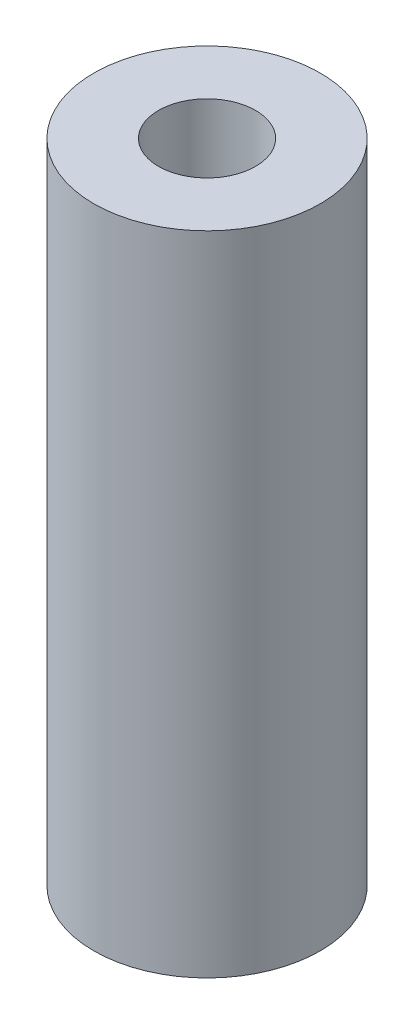
ISO-10303-21;
HEADER;
FILE_DESCRIPTION(('STEP AP214'),'2;1');
FILE_NAME('part.step','',(''),(''),'','','');
FILE_SCHEMA(('AUTOMOTIVE_DESIGN { 1 0 10303 214 1 1 1 1 }'));
ENDSEC;
DATA;
#1=APPLICATION_CONTEXT('core data for automotive mechanical design processes');
#2=APPLICATION_PROTOCOL_DEFINITION('international standard','automotive_design',2000,#1);
#3=PRODUCT_CONTEXT('',#1,'mechanical');
#4=PRODUCT('Part','Part','',(#3));
#5=PRODUCT_RELATED_PRODUCT_CATEGORY('part','',(#4));
#6=PRODUCT_DEFINITION_FORMATION('','',#4);
#7=PRODUCT_DEFINITION_CONTEXT('part definition',#1,'design');
#8=PRODUCT_DEFINITION('design','',#6,#7);
#9=PRODUCT_DEFINITION_SHAPE('','',#8);
#10=(LENGTH_UNIT() NAMED_UNIT(*) SI_UNIT(.MILLI.,.METRE.));
#11=(NAMED_UNIT(*) PLANE_ANGLE_UNIT() SI_UNIT($,.RADIAN.));
#12=(NAMED_UNIT(*) SI_UNIT($,.STERADIAN.) SOLID_ANGLE_UNIT());
#13=UNCERTAINTY_MEASURE_WITH_UNIT(LENGTH_MEASURE(1.E-05),#10,'distance_accuracy_value','');
#14=(GEOMETRIC_REPRESENTATION_CONTEXT(3) GLOBAL_UNCERTAINTY_ASSIGNED_CONTEXT((#13)) GLOBAL_UNIT_ASSIGNED_CONTEXT((#10,
#11,#12)) REPRESENTATION_CONTEXT('',''));
#15=CARTESIAN_POINT('',(0.,0.,0.));
#16=DIRECTION('',(0.,0.,1.));
#17=DIRECTION('',(1.,0.,0.));
#18=AXIS2_PLACEMENT_3D('',#15,#16,#17);
#19=CARTESIAN_POINT('',(0.,20.,0.));
#20=DIRECTION('',(0.,1.,0.));
#21=DIRECTION('',(0.,0.,1.));
#22=AXIS2_PLACEMENT_3D('',#19,#20,#21);
#23=PLANE('',#22);
#24=CARTESIAN_POINT('',(0.,20.,0.));
#25=DIRECTION('',(0.,1.,0.));
#26=DIRECTION('',(0.,0.,1.));
#27=AXIS2_PLACEMENT_3D('',#24,#25,#26);
#28=CIRCLE('',#27,3.5);
#29=CARTESIAN_POINT('',(0.,20.,3.5));
#30=VERTEX_POINT('',#29);
#31=EDGE_CURVE('E10',#30,#30,#28,.T.);
#32=ORIENTED_EDGE('',*,*,#31,.T.);
#33=EDGE_LOOP('',(#32));
#34=FACE_BOUND('',#33,.T.);
#35=CARTESIAN_POINT('',(0.,20.,0.));
#36=DIRECTION('',(0.,1.,0.));
#37=DIRECTION('',(0.,0.,1.));
#38=AXIS2_PLACEMENT_3D('',#35,#36,#37);
#39=CIRCLE('',#38,1.5);
#40=CARTESIAN_POINT('',(0.,20.,1.5));
#41=VERTEX_POINT('',#40);
#42=EDGE_CURVE('E48',#41,#41,#39,.T.);
#43=ORIENTED_EDGE('',*,*,#42,.F.);
#44=EDGE_LOOP('',(#43));
#45=FACE_BOUND('',#44,.T.);
#46=ADVANCED_FACE('F37',(#34,#45),#23,.T.);
#47=CARTESIAN_POINT('',(0.,0.,0.));
#48=DIRECTION('',(0.,1.,0.));
#49=DIRECTION('',(0.,0.,1.));
#50=AXIS2_PLACEMENT_3D('',#47,#48,#49);
#51=PLANE('',#50);
#52=CARTESIAN_POINT('',(0.,0.,0.));
#53=DIRECTION('',(0.,1.,0.));
#54=DIRECTION('',(0.,0.,1.));
#55=AXIS2_PLACEMENT_3D('',#52,#53,#54);
#56=CIRCLE('',#55,3.5);
#57=CARTESIAN_POINT('',(0.,0.,3.5));
#58=VERTEX_POINT('',#57);
#59=EDGE_CURVE('E41',#58,#58,#56,.T.);
#60=ORIENTED_EDGE('',*,*,#59,.F.);
#61=EDGE_LOOP('',(#60));
#62=FACE_BOUND('',#61,.T.);
#63=CARTESIAN_POINT('',(0.,0.,0.));
#64=DIRECTION('',(0.,1.,0.));
#65=DIRECTION('',(0.,0.,1.));
#66=AXIS2_PLACEMENT_3D('',#63,#64,#65);
#67=CIRCLE('',#66,1.5);
#68=CARTESIAN_POINT('',(0.,0.,1.5));
#69=VERTEX_POINT('',#68);
#70=EDGE_CURVE('E50',#69,#69,#67,.T.);
#71=ORIENTED_EDGE('',*,*,#70,.T.);
#72=EDGE_LOOP('',(#71));
#73=FACE_BOUND('',#72,.T.);
#74=ADVANCED_FACE('F60',(#62,#73),#51,.F.);
#75=CARTESIAN_POINT('',(0.,20.,0.));
#76=DIRECTION('',(0.,-1.,0.));
#77=DIRECTION('',(0.,0.,-1.));
#78=AXIS2_PLACEMENT_3D('',#75,#76,#77);
#79=CYLINDRICAL_SURFACE('',#78,3.5);
#80=ORIENTED_EDGE('',*,*,#31,.F.);
#81=EDGE_LOOP('',(#80));
#82=FACE_BOUND('',#81,.T.);
#83=ORIENTED_EDGE('',*,*,#59,.T.);
#84=EDGE_LOOP('',(#83));
#85=FACE_BOUND('',#84,.T.);
#86=ADVANCED_FACE('F39',(#82,#85),#79,.T.);
#87=CARTESIAN_POINT('',(0.,20.,0.));
#88=DIRECTION('',(0.,-1.,0.));
#89=DIRECTION('',(0.,0.,-1.));
#90=AXIS2_PLACEMENT_3D('',#87,#88,#89);
#91=CYLINDRICAL_SURFACE('',#90,1.5);
#92=ORIENTED_EDGE('',*,*,#42,.T.);
#93=EDGE_LOOP('',(#92));
#94=FACE_BOUND('',#93,.T.);
#95=ORIENTED_EDGE('',*,*,#70,.F.);
#96=EDGE_LOOP('',(#95));
#97=FACE_BOUND('',#96,.T.);
#98=ADVANCED_FACE('F56',(#94,#97),#91,.F.);
#99=CLOSED_SHELL('',(#46,#74,#86,#98));
#100=MANIFOLD_SOLID_BREP('B2',#99);
#101=ADVANCED_BREP_SHAPE_REPRESENTATION('',(#18,#100),#14);
#102=SHAPE_DEFINITION_REPRESENTATION(#9,#101);
ENDSEC;
END-ISO-10303-21;
